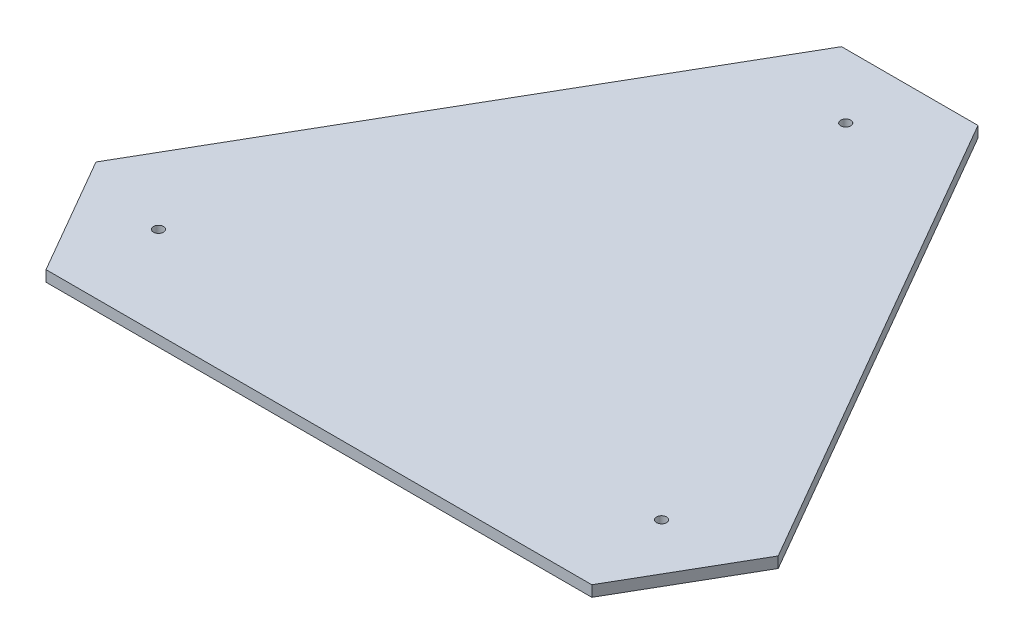
ISO-10303-21;
HEADER;
FILE_DESCRIPTION(('STEP AP214'),'2;1');
FILE_NAME('part.step','',(''),(''),'','','');
FILE_SCHEMA(('AUTOMOTIVE_DESIGN { 1 0 10303 214 1 1 1 1 }'));
ENDSEC;
DATA;
#1=APPLICATION_CONTEXT('core data for automotive mechanical design processes');
#2=APPLICATION_PROTOCOL_DEFINITION('international standard','automotive_design',2000,#1);
#3=PRODUCT_CONTEXT('',#1,'mechanical');
#4=PRODUCT('Part','Part','',(#3));
#5=PRODUCT_RELATED_PRODUCT_CATEGORY('part','',(#4));
#6=PRODUCT_DEFINITION_FORMATION('','',#4);
#7=PRODUCT_DEFINITION_CONTEXT('part definition',#1,'design');
#8=PRODUCT_DEFINITION('design','',#6,#7);
#9=PRODUCT_DEFINITION_SHAPE('','',#8);
#10=(LENGTH_UNIT() NAMED_UNIT(*) SI_UNIT(.MILLI.,.METRE.));
#11=(NAMED_UNIT(*) PLANE_ANGLE_UNIT() SI_UNIT($,.RADIAN.));
#12=(NAMED_UNIT(*) SI_UNIT($,.STERADIAN.) SOLID_ANGLE_UNIT());
#13=UNCERTAINTY_MEASURE_WITH_UNIT(LENGTH_MEASURE(1.E-05),#10,'distance_accuracy_value','');
#14=(GEOMETRIC_REPRESENTATION_CONTEXT(3) GLOBAL_UNCERTAINTY_ASSIGNED_CONTEXT((#13)) GLOBAL_UNIT_ASSIGNED_CONTEXT((#10,
#11,#12)) REPRESENTATION_CONTEXT('',''));
#15=CARTESIAN_POINT('',(0.,0.,0.));
#16=DIRECTION('',(0.,0.,1.));
#17=DIRECTION('',(1.,0.,0.));
#18=AXIS2_PLACEMENT_3D('',#15,#16,#17);
#19=CARTESIAN_POINT('',(-187.5,6.,64.9519052838329));
#20=DIRECTION('',(0.866025403784439,0.,0.5));
#21=DIRECTION('',(0.5,0.,-0.866025403784439));
#22=AXIS2_PLACEMENT_3D('',#19,#20,#21);
#23=PLANE('',#22);
#24=DIRECTION('',(-0.5,0.,0.866025403784439));
#25=VECTOR('',#24,1.);
#26=CARTESIAN_POINT('',(-187.5,0.,64.9519052838329));
#27=LINE('',#26,#25);
#28=CARTESIAN_POINT('',(-37.5,0.,-194.855715851499));
#29=VERTEX_POINT('',#28);
#30=CARTESIAN_POINT('',(-187.5,0.,64.9519052838329));
#31=VERTEX_POINT('',#30);
#32=EDGE_CURVE('E118',#29,#31,#27,.T.);
#33=ORIENTED_EDGE('',*,*,#32,.T.);
#34=DIRECTION('',(0.,-1.,0.));
#35=VECTOR('',#34,1.);
#36=CARTESIAN_POINT('',(-187.5,6.,64.9519052838329));
#37=LINE('',#36,#35);
#38=CARTESIAN_POINT('',(-187.5,6.,64.9519052838329));
#39=VERTEX_POINT('',#38);
#40=EDGE_CURVE('E11',#39,#31,#37,.T.);
#41=ORIENTED_EDGE('',*,*,#40,.F.);
#42=DIRECTION('',(-0.5,0.,0.866025403784439));
#43=VECTOR('',#42,1.);
#44=CARTESIAN_POINT('',(-187.5,6.,64.9519052838329));
#45=LINE('',#44,#43);
#46=CARTESIAN_POINT('',(-37.5,6.,-194.855715851499));
#47=VERTEX_POINT('',#46);
#48=EDGE_CURVE('E129',#47,#39,#45,.T.);
#49=ORIENTED_EDGE('',*,*,#48,.F.);
#50=DIRECTION('',(0.,-1.,0.));
#51=VECTOR('',#50,1.);
#52=CARTESIAN_POINT('',(-37.5,6.,-194.855715851499));
#53=LINE('',#52,#51);
#54=EDGE_CURVE('E114',#47,#29,#53,.T.);
#55=ORIENTED_EDGE('',*,*,#54,.T.);
#56=EDGE_LOOP('',(#33,#41,#49,#55));
#57=FACE_BOUND('',#56,.T.);
#58=ADVANCED_FACE('F34',(#57),#23,.F.);
#59=CARTESIAN_POINT('',(-150.,6.,129.903810567666));
#60=DIRECTION('',(0.866025403784439,0.,-0.499999999999999));
#61=DIRECTION('',(-0.499999999999999,0.,-0.866025403784439));
#62=AXIS2_PLACEMENT_3D('',#59,#60,#61);
#63=PLANE('',#62);
#64=DIRECTION('',(0.499999999999999,0.,0.866025403784439));
#65=VECTOR('',#64,1.);
#66=CARTESIAN_POINT('',(-150.,0.,129.903810567666));
#67=LINE('',#66,#65);
#68=CARTESIAN_POINT('',(-150.,0.,129.903810567666));
#69=VERTEX_POINT('',#68);
#70=EDGE_CURVE('E121',#31,#69,#67,.T.);
#71=ORIENTED_EDGE('',*,*,#70,.T.);
#72=DIRECTION('',(0.,-1.,0.));
#73=VECTOR('',#72,1.);
#74=CARTESIAN_POINT('',(-150.,6.,129.903810567666));
#75=LINE('',#74,#73);
#76=CARTESIAN_POINT('',(-150.,6.,129.903810567666));
#77=VERTEX_POINT('',#76);
#78=EDGE_CURVE('E42',#77,#69,#75,.T.);
#79=ORIENTED_EDGE('',*,*,#78,.F.);
#80=DIRECTION('',(0.499999999999999,0.,0.866025403784439));
#81=VECTOR('',#80,1.);
#82=CARTESIAN_POINT('',(-150.,6.,129.903810567666));
#83=LINE('',#82,#81);
#84=EDGE_CURVE('E87',#39,#77,#83,.T.);
#85=ORIENTED_EDGE('',*,*,#84,.F.);
#86=ORIENTED_EDGE('',*,*,#40,.T.);
#87=EDGE_LOOP('',(#71,#79,#85,#86));
#88=FACE_BOUND('',#87,.T.);
#89=ADVANCED_FACE('F155',(#88),#63,.F.);
#90=CARTESIAN_POINT('',(150.,6.,129.903810567666));
#91=DIRECTION('',(0.,0.,-1.));
#92=DIRECTION('',(-1.,0.,0.));
#93=AXIS2_PLACEMENT_3D('',#90,#91,#92);
#94=PLANE('',#93);
#95=DIRECTION('',(1.,0.,0.));
#96=VECTOR('',#95,1.);
#97=CARTESIAN_POINT('',(150.,0.,129.903810567666));
#98=LINE('',#97,#96);
#99=CARTESIAN_POINT('',(150.,0.,129.903810567666));
#100=VERTEX_POINT('',#99);
#101=EDGE_CURVE('E124',#69,#100,#98,.T.);
#102=ORIENTED_EDGE('',*,*,#101,.T.);
#103=DIRECTION('',(0.,-1.,0.));
#104=VECTOR('',#103,1.);
#105=CARTESIAN_POINT('',(150.,6.,129.903810567666));
#106=LINE('',#105,#104);
#107=CARTESIAN_POINT('',(150.,6.,129.903810567666));
#108=VERTEX_POINT('',#107);
#109=EDGE_CURVE('E109',#108,#100,#106,.T.);
#110=ORIENTED_EDGE('',*,*,#109,.F.);
#111=DIRECTION('',(1.,0.,0.));
#112=VECTOR('',#111,1.);
#113=CARTESIAN_POINT('',(150.,6.,129.903810567666));
#114=LINE('',#113,#112);
#115=EDGE_CURVE('E100',#77,#108,#114,.T.);
#116=ORIENTED_EDGE('',*,*,#115,.F.);
#117=ORIENTED_EDGE('',*,*,#78,.T.);
#118=EDGE_LOOP('',(#102,#110,#116,#117));
#119=FACE_BOUND('',#118,.T.);
#120=ADVANCED_FACE('F135',(#119),#94,.F.);
#121=CARTESIAN_POINT('',(187.5,6.,64.9519052838328));
#122=DIRECTION('',(-0.866025403784439,0.,-0.499999999999999));
#123=DIRECTION('',(-0.499999999999999,0.,0.866025403784439));
#124=AXIS2_PLACEMENT_3D('',#121,#122,#123);
#125=PLANE('',#124);
#126=DIRECTION('',(0.499999999999999,0.,-0.866025403784439));
#127=VECTOR('',#126,1.);
#128=CARTESIAN_POINT('',(187.5,0.,64.9519052838328));
#129=LINE('',#128,#127);
#130=CARTESIAN_POINT('',(187.5,0.,64.9519052838328));
#131=VERTEX_POINT('',#130);
#132=EDGE_CURVE('E108',#100,#131,#129,.T.);
#133=ORIENTED_EDGE('',*,*,#132,.T.);
#134=DIRECTION('',(0.,-1.,0.));
#135=VECTOR('',#134,1.);
#136=CARTESIAN_POINT('',(187.5,6.,64.9519052838328));
#137=LINE('',#136,#135);
#138=CARTESIAN_POINT('',(187.5,6.,64.9519052838328));
#139=VERTEX_POINT('',#138);
#140=EDGE_CURVE('E105',#139,#131,#137,.T.);
#141=ORIENTED_EDGE('',*,*,#140,.F.);
#142=DIRECTION('',(0.499999999999999,0.,-0.866025403784439));
#143=VECTOR('',#142,1.);
#144=CARTESIAN_POINT('',(187.5,6.,64.9519052838328));
#145=LINE('',#144,#143);
#146=EDGE_CURVE('E94',#108,#139,#145,.T.);
#147=ORIENTED_EDGE('',*,*,#146,.F.);
#148=ORIENTED_EDGE('',*,*,#109,.T.);
#149=EDGE_LOOP('',(#133,#141,#147,#148));
#150=FACE_BOUND('',#149,.T.);
#151=ADVANCED_FACE('F106',(#150),#125,.F.);
#152=CARTESIAN_POINT('',(37.4999999999999,6.,-194.855715851499));
#153=DIRECTION('',(-0.866025403784439,0.,0.5));
#154=DIRECTION('',(0.5,0.,0.866025403784439));
#155=AXIS2_PLACEMENT_3D('',#152,#153,#154);
#156=PLANE('',#155);
#157=DIRECTION('',(-0.5,0.,-0.866025403784439));
#158=VECTOR('',#157,1.);
#159=CARTESIAN_POINT('',(37.4999999999999,0.,-194.855715851499));
#160=LINE('',#159,#158);
#161=CARTESIAN_POINT('',(37.4999999999999,0.,-194.855715851499));
#162=VERTEX_POINT('',#161);
#163=EDGE_CURVE('E73',#131,#162,#160,.T.);
#164=ORIENTED_EDGE('',*,*,#163,.T.);
#165=DIRECTION('',(0.,-1.,0.));
#166=VECTOR('',#165,1.);
#167=CARTESIAN_POINT('',(37.4999999999999,6.,-194.855715851499));
#168=LINE('',#167,#166);
#169=CARTESIAN_POINT('',(37.4999999999999,6.,-194.855715851499));
#170=VERTEX_POINT('',#169);
#171=EDGE_CURVE('E110',#170,#162,#168,.T.);
#172=ORIENTED_EDGE('',*,*,#171,.F.);
#173=DIRECTION('',(-0.5,0.,-0.866025403784439));
#174=VECTOR('',#173,1.);
#175=CARTESIAN_POINT('',(37.4999999999999,6.,-194.855715851499));
#176=LINE('',#175,#174);
#177=EDGE_CURVE('E98',#139,#170,#176,.T.);
#178=ORIENTED_EDGE('',*,*,#177,.F.);
#179=ORIENTED_EDGE('',*,*,#140,.T.);
#180=EDGE_LOOP('',(#164,#172,#178,#179));
#181=FACE_BOUND('',#180,.T.);
#182=ADVANCED_FACE('F112',(#181),#156,.F.);
#183=CARTESIAN_POINT('',(-37.5,6.,-194.855715851499));
#184=DIRECTION('',(0.,0.,1.));
#185=DIRECTION('',(1.,0.,0.));
#186=AXIS2_PLACEMENT_3D('',#183,#184,#185);
#187=PLANE('',#186);
#188=DIRECTION('',(-1.,0.,0.));
#189=VECTOR('',#188,1.);
#190=CARTESIAN_POINT('',(-37.5,0.,-194.855715851499));
#191=LINE('',#190,#189);
#192=EDGE_CURVE('E79',#162,#29,#191,.T.);
#193=ORIENTED_EDGE('',*,*,#192,.T.);
#194=ORIENTED_EDGE('',*,*,#54,.F.);
#195=DIRECTION('',(-1.,0.,0.));
#196=VECTOR('',#195,1.);
#197=CARTESIAN_POINT('',(-37.5,6.,-194.855715851499));
#198=LINE('',#197,#196);
#199=EDGE_CURVE('E50',#170,#47,#198,.T.);
#200=ORIENTED_EDGE('',*,*,#199,.F.);
#201=ORIENTED_EDGE('',*,*,#171,.T.);
#202=EDGE_LOOP('',(#193,#194,#200,#201));
#203=FACE_BOUND('',#202,.T.);
#204=ADVANCED_FACE('F142',(#203),#187,.F.);
#205=CARTESIAN_POINT('',(0.,6.,0.));
#206=DIRECTION('',(0.,-1.,0.));
#207=DIRECTION('',(0.,0.,-1.));
#208=AXIS2_PLACEMENT_3D('',#205,#206,#207);
#209=PLANE('',#208);
#210=CARTESIAN_POINT('',(-138.253529965215,6.,79.820712741832));
#211=DIRECTION('',(0.,1.,0.));
#212=DIRECTION('',(0.,0.,1.));
#213=AXIS2_PLACEMENT_3D('',#210,#211,#212);
#214=CIRCLE('',#213,2.75000000000001);
#215=CARTESIAN_POINT('',(-138.253529965215,6.,82.570712741832));
#216=VERTEX_POINT('',#215);
#217=EDGE_CURVE('E226',#216,#216,#214,.T.);
#218=ORIENTED_EDGE('',*,*,#217,.F.);
#219=EDGE_LOOP('',(#218));
#220=FACE_BOUND('',#219,.T.);
#221=CARTESIAN_POINT('',(138.253529965209,6.,79.8207127418302));
#222=DIRECTION('',(0.,1.,0.));
#223=DIRECTION('',(0.,0.,1.));
#224=AXIS2_PLACEMENT_3D('',#221,#222,#223);
#225=CIRCLE('',#224,2.75000000000001);
#226=CARTESIAN_POINT('',(138.253529965209,6.,82.5707127418302));
#227=VERTEX_POINT('',#226);
#228=EDGE_CURVE('E231',#227,#227,#225,.T.);
#229=ORIENTED_EDGE('',*,*,#228,.F.);
#230=EDGE_LOOP('',(#229));
#231=FACE_BOUND('',#230,.T.);
#232=CARTESIAN_POINT('',(0.,6.,-159.641425483665));
#233=DIRECTION('',(0.,1.,0.));
#234=DIRECTION('',(0.,0.,1.));
#235=AXIS2_PLACEMENT_3D('',#232,#233,#234);
#236=CIRCLE('',#235,2.75);
#237=CARTESIAN_POINT('',(0.,6.,-156.891425483665));
#238=VERTEX_POINT('',#237);
#239=EDGE_CURVE('E122',#238,#238,#236,.T.);
#240=ORIENTED_EDGE('',*,*,#239,.F.);
#241=EDGE_LOOP('',(#240));
#242=FACE_BOUND('',#241,.T.);
#243=ORIENTED_EDGE('',*,*,#48,.T.);
#244=ORIENTED_EDGE('',*,*,#84,.T.);
#245=ORIENTED_EDGE('',*,*,#115,.T.);
#246=ORIENTED_EDGE('',*,*,#146,.T.);
#247=ORIENTED_EDGE('',*,*,#177,.T.);
#248=ORIENTED_EDGE('',*,*,#199,.T.);
#249=EDGE_LOOP('',(#243,#244,#245,#246,#247,#248));
#250=FACE_BOUND('',#249,.T.);
#251=ADVANCED_FACE('F96',(#220,#231,#242,#250),#209,.F.);
#252=CARTESIAN_POINT('',(0.,0.,0.));
#253=DIRECTION('',(0.,-1.,0.));
#254=DIRECTION('',(0.,0.,-1.));
#255=AXIS2_PLACEMENT_3D('',#252,#253,#254);
#256=PLANE('',#255);
#257=CARTESIAN_POINT('',(-138.253529965215,0.,79.820712741832));
#258=DIRECTION('',(0.,-1.,0.));
#259=DIRECTION('',(0.,0.,-1.));
#260=AXIS2_PLACEMENT_3D('',#257,#258,#259);
#261=CIRCLE('',#260,2.75000000000001);
#262=CARTESIAN_POINT('',(-138.253529965215,0.,82.570712741832));
#263=VERTEX_POINT('',#262);
#264=EDGE_CURVE('E223',#263,#263,#261,.F.);
#265=ORIENTED_EDGE('',*,*,#264,.T.);
#266=EDGE_LOOP('',(#265));
#267=FACE_BOUND('',#266,.T.);
#268=CARTESIAN_POINT('',(138.253529965209,0.,79.8207127418302));
#269=DIRECTION('',(0.,-1.,0.));
#270=DIRECTION('',(0.,0.,-1.));
#271=AXIS2_PLACEMENT_3D('',#268,#269,#270);
#272=CIRCLE('',#271,2.75000000000001);
#273=CARTESIAN_POINT('',(138.253529965209,0.,82.5707127418302));
#274=VERTEX_POINT('',#273);
#275=EDGE_CURVE('E236',#274,#274,#272,.F.);
#276=ORIENTED_EDGE('',*,*,#275,.T.);
#277=EDGE_LOOP('',(#276));
#278=FACE_BOUND('',#277,.T.);
#279=CARTESIAN_POINT('',(0.,0.,-159.641425483665));
#280=DIRECTION('',(0.,-1.,0.));
#281=DIRECTION('',(0.,0.,-1.));
#282=AXIS2_PLACEMENT_3D('',#279,#280,#281);
#283=CIRCLE('',#282,2.75);
#284=CARTESIAN_POINT('',(0.,0.,-156.891425483665));
#285=VERTEX_POINT('',#284);
#286=EDGE_CURVE('E227',#285,#285,#283,.F.);
#287=ORIENTED_EDGE('',*,*,#286,.T.);
#288=EDGE_LOOP('',(#287));
#289=FACE_BOUND('',#288,.T.);
#290=ORIENTED_EDGE('',*,*,#32,.F.);
#291=ORIENTED_EDGE('',*,*,#192,.F.);
#292=ORIENTED_EDGE('',*,*,#163,.F.);
#293=ORIENTED_EDGE('',*,*,#132,.F.);
#294=ORIENTED_EDGE('',*,*,#101,.F.);
#295=ORIENTED_EDGE('',*,*,#70,.F.);
#296=EDGE_LOOP('',(#290,#291,#292,#293,#294,#295));
#297=FACE_BOUND('',#296,.T.);
#298=ADVANCED_FACE('F138',(#267,#278,#289,#297),#256,.T.);
#299=CARTESIAN_POINT('',(0.,-0.00100000000000013,-159.641425483665));
#300=DIRECTION('',(0.,1.,0.));
#301=DIRECTION('',(0.,0.,1.));
#302=AXIS2_PLACEMENT_3D('',#299,#300,#301);
#303=CYLINDRICAL_SURFACE('',#302,2.75);
#304=CARTESIAN_POINT('',(0.,0.,-156.891425483665));
#305=CARTESIAN_POINT('',(0.,0.0624999999999999,-156.891425483665));
#306=CARTESIAN_POINT('',(0.,0.125,-156.891425483665));
#307=CARTESIAN_POINT('',(0.,0.25,-156.891425483665));
#308=CARTESIAN_POINT('',(0.,0.3125,-156.891425483665));
#309=CARTESIAN_POINT('',(0.,0.4375,-156.891425483665));
#310=CARTESIAN_POINT('',(0.,0.5,-156.891425483665));
#311=CARTESIAN_POINT('',(0.,0.625,-156.891425483665));
#312=CARTESIAN_POINT('',(0.,0.6875,-156.891425483665));
#313=CARTESIAN_POINT('',(0.,0.8125,-156.891425483665));
#314=CARTESIAN_POINT('',(0.,0.875,-156.891425483665));
#315=CARTESIAN_POINT('',(0.,1.,-156.891425483665));
#316=CARTESIAN_POINT('',(0.,1.0625,-156.891425483665));
#317=CARTESIAN_POINT('',(0.,1.1875,-156.891425483665));
#318=CARTESIAN_POINT('',(0.,1.25,-156.891425483665));
#319=CARTESIAN_POINT('',(0.,1.375,-156.891425483665));
#320=CARTESIAN_POINT('',(0.,1.4375,-156.891425483665));
#321=CARTESIAN_POINT('',(0.,1.5625,-156.891425483665));
#322=CARTESIAN_POINT('',(0.,1.625,-156.891425483665));
#323=CARTESIAN_POINT('',(0.,1.75,-156.891425483665));
#324=CARTESIAN_POINT('',(0.,1.8125,-156.891425483665));
#325=CARTESIAN_POINT('',(0.,1.9375,-156.891425483665));
#326=CARTESIAN_POINT('',(0.,2.,-156.891425483665));
#327=CARTESIAN_POINT('',(0.,2.125,-156.891425483665));
#328=CARTESIAN_POINT('',(0.,2.1875,-156.891425483665));
#329=CARTESIAN_POINT('',(0.,2.3125,-156.891425483665));
#330=CARTESIAN_POINT('',(0.,2.375,-156.891425483665));
#331=CARTESIAN_POINT('',(0.,2.5,-156.891425483665));
#332=CARTESIAN_POINT('',(0.,2.5625,-156.891425483665));
#333=CARTESIAN_POINT('',(0.,2.6875,-156.891425483665));
#334=CARTESIAN_POINT('',(0.,2.75,-156.891425483665));
#335=CARTESIAN_POINT('',(0.,2.875,-156.891425483665));
#336=CARTESIAN_POINT('',(0.,2.9375,-156.891425483665));
#337=CARTESIAN_POINT('',(0.,3.0625,-156.891425483665));
#338=CARTESIAN_POINT('',(0.,3.125,-156.891425483665));
#339=CARTESIAN_POINT('',(0.,3.25,-156.891425483665));
#340=CARTESIAN_POINT('',(0.,3.3125,-156.891425483665));
#341=CARTESIAN_POINT('',(0.,3.4375,-156.891425483665));
#342=CARTESIAN_POINT('',(0.,3.5,-156.891425483665));
#343=CARTESIAN_POINT('',(0.,3.625,-156.891425483665));
#344=CARTESIAN_POINT('',(0.,3.6875,-156.891425483665));
#345=CARTESIAN_POINT('',(0.,3.8125,-156.891425483665));
#346=CARTESIAN_POINT('',(0.,3.875,-156.891425483665));
#347=CARTESIAN_POINT('',(0.,4.,-156.891425483665));
#348=CARTESIAN_POINT('',(0.,4.0625,-156.891425483665));
#349=CARTESIAN_POINT('',(0.,4.1875,-156.891425483665));
#350=CARTESIAN_POINT('',(0.,4.25,-156.891425483665));
#351=CARTESIAN_POINT('',(0.,4.375,-156.891425483665));
#352=CARTESIAN_POINT('',(0.,4.4375,-156.891425483665));
#353=CARTESIAN_POINT('',(0.,4.5625,-156.891425483665));
#354=CARTESIAN_POINT('',(0.,4.625,-156.891425483665));
#355=CARTESIAN_POINT('',(0.,4.75,-156.891425483665));
#356=CARTESIAN_POINT('',(0.,4.8125,-156.891425483665));
#357=CARTESIAN_POINT('',(0.,4.9375,-156.891425483665));
#358=CARTESIAN_POINT('',(0.,5.,-156.891425483665));
#359=CARTESIAN_POINT('',(0.,5.125,-156.891425483665));
#360=CARTESIAN_POINT('',(0.,5.1875,-156.891425483665));
#361=CARTESIAN_POINT('',(0.,5.3125,-156.891425483665));
#362=CARTESIAN_POINT('',(0.,5.375,-156.891425483665));
#363=CARTESIAN_POINT('',(0.,5.5,-156.891425483665));
#364=CARTESIAN_POINT('',(0.,5.5625,-156.891425483665));
#365=CARTESIAN_POINT('',(0.,5.6875,-156.891425483665));
#366=CARTESIAN_POINT('',(0.,5.75,-156.891425483665));
#367=CARTESIAN_POINT('',(0.,5.875,-156.891425483665));
#368=CARTESIAN_POINT('',(0.,5.9375,-156.891425483665));
#369=CARTESIAN_POINT('',(0.,6.,-156.891425483665));
#370=B_SPLINE_CURVE_WITH_KNOTS('',3,(#304,#305,#306,#307,#308,#309,#310,#311,#312,#313,#314,
#315,#316,#317,#318,#319,#320,#321,#322,#323,#324,#325,#326,#327,#328,#329,#330,#331,#332,#333,
#334,#335,#336,#337,#338,#339,#340,#341,#342,#343,#344,#345,#346,#347,#348,#349,#350,#351,#352,
#353,#354,#355,#356,#357,#358,#359,#360,#361,#362,#363,#364,#365,#366,#367,#368,#369),
.UNSPECIFIED.,.F.,.F.,(4,2,2,2,2,2,2,2,2,2,2,2,2,2,2,2,2,2,2,2,2,2,2,2,2,2,2,2,2,2,2,2,4),(0.,
0.1875,0.375,0.5625,0.75,0.9375,1.125,1.3125,1.5,1.6875,1.875,2.0625,2.25,2.4375,2.625,2.8125,
3.,3.1875,3.375,3.5625,3.75,3.9375,4.125,4.3125,4.5,4.6875,4.875,5.0625,5.25,5.4375,5.625,
5.8125,6.),.UNSPECIFIED.);
#371=EDGE_CURVE('BSEAM188',#285,#238,#370,.T.);
#372=ORIENTED_EDGE('',*,*,#286,.F.);
#373=ORIENTED_EDGE('',*,*,#239,.T.);
#374=ORIENTED_EDGE('',*,*,#371,.T.);
#375=ORIENTED_EDGE('',*,*,#371,.F.);
#376=EDGE_LOOP('',(#372,#374,#373,#375));
#377=FACE_BOUND('',#376,.T.);
#378=ADVANCED_FACE('F188',(#377),#303,.F.);
#379=CARTESIAN_POINT('',(138.253529965209,-0.00100000000000013,79.8207127418302));
#380=DIRECTION('',(0.,1.,0.));
#381=DIRECTION('',(0.,0.,1.));
#382=AXIS2_PLACEMENT_3D('',#379,#380,#381);
#383=CYLINDRICAL_SURFACE('',#382,2.75000000000001);
#384=CARTESIAN_POINT('',(138.253529965209,0.,82.5707127418302));
#385=CARTESIAN_POINT('',(138.253529965209,0.0624999999999999,82.5707127418302));
#386=CARTESIAN_POINT('',(138.253529965209,0.125,82.5707127418302));
#387=CARTESIAN_POINT('',(138.253529965209,0.25,82.5707127418302));
#388=CARTESIAN_POINT('',(138.253529965209,0.3125,82.5707127418302));
#389=CARTESIAN_POINT('',(138.253529965209,0.4375,82.5707127418302));
#390=CARTESIAN_POINT('',(138.253529965209,0.5,82.5707127418302));
#391=CARTESIAN_POINT('',(138.253529965209,0.625,82.5707127418302));
#392=CARTESIAN_POINT('',(138.253529965209,0.6875,82.5707127418302));
#393=CARTESIAN_POINT('',(138.253529965209,0.8125,82.5707127418302));
#394=CARTESIAN_POINT('',(138.253529965209,0.875,82.5707127418302));
#395=CARTESIAN_POINT('',(138.253529965209,1.,82.5707127418302));
#396=CARTESIAN_POINT('',(138.253529965209,1.0625,82.5707127418302));
#397=CARTESIAN_POINT('',(138.253529965209,1.1875,82.5707127418302));
#398=CARTESIAN_POINT('',(138.253529965209,1.25,82.5707127418302));
#399=CARTESIAN_POINT('',(138.253529965209,1.375,82.5707127418302));
#400=CARTESIAN_POINT('',(138.253529965209,1.4375,82.5707127418302));
#401=CARTESIAN_POINT('',(138.253529965209,1.5625,82.5707127418302));
#402=CARTESIAN_POINT('',(138.253529965209,1.625,82.5707127418302));
#403=CARTESIAN_POINT('',(138.253529965209,1.75,82.5707127418302));
#404=CARTESIAN_POINT('',(138.253529965209,1.8125,82.5707127418302));
#405=CARTESIAN_POINT('',(138.253529965209,1.9375,82.5707127418302));
#406=CARTESIAN_POINT('',(138.253529965209,2.,82.5707127418302));
#407=CARTESIAN_POINT('',(138.253529965209,2.125,82.5707127418302));
#408=CARTESIAN_POINT('',(138.253529965209,2.1875,82.5707127418302));
#409=CARTESIAN_POINT('',(138.253529965209,2.3125,82.5707127418302));
#410=CARTESIAN_POINT('',(138.253529965209,2.375,82.5707127418302));
#411=CARTESIAN_POINT('',(138.253529965209,2.5,82.5707127418302));
#412=CARTESIAN_POINT('',(138.253529965209,2.5625,82.5707127418302));
#413=CARTESIAN_POINT('',(138.253529965209,2.6875,82.5707127418302));
#414=CARTESIAN_POINT('',(138.253529965209,2.75,82.5707127418302));
#415=CARTESIAN_POINT('',(138.253529965209,2.875,82.5707127418302));
#416=CARTESIAN_POINT('',(138.253529965209,2.9375,82.5707127418302));
#417=CARTESIAN_POINT('',(138.253529965209,3.0625,82.5707127418302));
#418=CARTESIAN_POINT('',(138.253529965209,3.125,82.5707127418302));
#419=CARTESIAN_POINT('',(138.253529965209,3.25,82.5707127418302));
#420=CARTESIAN_POINT('',(138.253529965209,3.3125,82.5707127418302));
#421=CARTESIAN_POINT('',(138.253529965209,3.4375,82.5707127418302));
#422=CARTESIAN_POINT('',(138.253529965209,3.5,82.5707127418302));
#423=CARTESIAN_POINT('',(138.253529965209,3.625,82.5707127418302));
#424=CARTESIAN_POINT('',(138.253529965209,3.6875,82.5707127418302));
#425=CARTESIAN_POINT('',(138.253529965209,3.8125,82.5707127418302));
#426=CARTESIAN_POINT('',(138.253529965209,3.875,82.5707127418302));
#427=CARTESIAN_POINT('',(138.253529965209,4.,82.5707127418302));
#428=CARTESIAN_POINT('',(138.253529965209,4.0625,82.5707127418302));
#429=CARTESIAN_POINT('',(138.253529965209,4.1875,82.5707127418302));
#430=CARTESIAN_POINT('',(138.253529965209,4.25,82.5707127418302));
#431=CARTESIAN_POINT('',(138.253529965209,4.375,82.5707127418302));
#432=CARTESIAN_POINT('',(138.253529965209,4.4375,82.5707127418302));
#433=CARTESIAN_POINT('',(138.253529965209,4.5625,82.5707127418302));
#434=CARTESIAN_POINT('',(138.253529965209,4.625,82.5707127418302));
#435=CARTESIAN_POINT('',(138.253529965209,4.75,82.5707127418302));
#436=CARTESIAN_POINT('',(138.253529965209,4.8125,82.5707127418302));
#437=CARTESIAN_POINT('',(138.253529965209,4.9375,82.5707127418302));
#438=CARTESIAN_POINT('',(138.253529965209,5.,82.5707127418302));
#439=CARTESIAN_POINT('',(138.253529965209,5.125,82.5707127418302));
#440=CARTESIAN_POINT('',(138.253529965209,5.1875,82.5707127418302));
#441=CARTESIAN_POINT('',(138.253529965209,5.3125,82.5707127418302));
#442=CARTESIAN_POINT('',(138.253529965209,5.375,82.5707127418302));
#443=CARTESIAN_POINT('',(138.253529965209,5.5,82.5707127418302));
#444=CARTESIAN_POINT('',(138.253529965209,5.5625,82.5707127418302));
#445=CARTESIAN_POINT('',(138.253529965209,5.6875,82.5707127418302));
#446=CARTESIAN_POINT('',(138.253529965209,5.75,82.5707127418302));
#447=CARTESIAN_POINT('',(138.253529965209,5.875,82.5707127418302));
#448=CARTESIAN_POINT('',(138.253529965209,5.9375,82.5707127418302));
#449=CARTESIAN_POINT('',(138.253529965209,6.,82.5707127418302));
#450=B_SPLINE_CURVE_WITH_KNOTS('',3,(#384,#385,#386,#387,#388,#389,#390,#391,#392,#393,#394,
#395,#396,#397,#398,#399,#400,#401,#402,#403,#404,#405,#406,#407,#408,#409,#410,#411,#412,#413,
#414,#415,#416,#417,#418,#419,#420,#421,#422,#423,#424,#425,#426,#427,#428,#429,#430,#431,#432,
#433,#434,#435,#436,#437,#438,#439,#440,#441,#442,#443,#444,#445,#446,#447,#448,#449),
.UNSPECIFIED.,.F.,.F.,(4,2,2,2,2,2,2,2,2,2,2,2,2,2,2,2,2,2,2,2,2,2,2,2,2,2,2,2,2,2,2,2,4),(0.,
0.1875,0.375,0.5625,0.75,0.9375,1.125,1.3125,1.5,1.6875,1.875,2.0625,2.25,2.4375,2.625,2.8125,
3.,3.1875,3.375,3.5625,3.75,3.9375,4.125,4.3125,4.5,4.6875,4.875,5.0625,5.25,5.4375,5.625,
5.8125,6.),.UNSPECIFIED.);
#451=EDGE_CURVE('BSEAM196',#274,#227,#450,.T.);
#452=ORIENTED_EDGE('',*,*,#275,.F.);
#453=ORIENTED_EDGE('',*,*,#228,.T.);
#454=ORIENTED_EDGE('',*,*,#451,.T.);
#455=ORIENTED_EDGE('',*,*,#451,.F.);
#456=EDGE_LOOP('',(#452,#454,#453,#455));
#457=FACE_BOUND('',#456,.T.);
#458=ADVANCED_FACE('F196',(#457),#383,.F.);
#459=CARTESIAN_POINT('',(-138.253529965215,-0.00100000000000013,79.820712741832));
#460=DIRECTION('',(0.,1.,0.));
#461=DIRECTION('',(0.,0.,1.));
#462=AXIS2_PLACEMENT_3D('',#459,#460,#461);
#463=CYLINDRICAL_SURFACE('',#462,2.75000000000001);
#464=CARTESIAN_POINT('',(-138.253529965215,0.,82.570712741832));
#465=CARTESIAN_POINT('',(-138.253529965215,0.0624999999999999,82.570712741832));
#466=CARTESIAN_POINT('',(-138.253529965215,0.125,82.570712741832));
#467=CARTESIAN_POINT('',(-138.253529965215,0.25,82.570712741832));
#468=CARTESIAN_POINT('',(-138.253529965215,0.3125,82.570712741832));
#469=CARTESIAN_POINT('',(-138.253529965215,0.4375,82.570712741832));
#470=CARTESIAN_POINT('',(-138.253529965215,0.5,82.570712741832));
#471=CARTESIAN_POINT('',(-138.253529965215,0.625,82.570712741832));
#472=CARTESIAN_POINT('',(-138.253529965215,0.6875,82.570712741832));
#473=CARTESIAN_POINT('',(-138.253529965215,0.8125,82.570712741832));
#474=CARTESIAN_POINT('',(-138.253529965215,0.875,82.570712741832));
#475=CARTESIAN_POINT('',(-138.253529965215,1.,82.570712741832));
#476=CARTESIAN_POINT('',(-138.253529965215,1.0625,82.570712741832));
#477=CARTESIAN_POINT('',(-138.253529965215,1.1875,82.570712741832));
#478=CARTESIAN_POINT('',(-138.253529965215,1.25,82.570712741832));
#479=CARTESIAN_POINT('',(-138.253529965215,1.375,82.570712741832));
#480=CARTESIAN_POINT('',(-138.253529965215,1.4375,82.570712741832));
#481=CARTESIAN_POINT('',(-138.253529965215,1.5625,82.570712741832));
#482=CARTESIAN_POINT('',(-138.253529965215,1.625,82.570712741832));
#483=CARTESIAN_POINT('',(-138.253529965215,1.75,82.570712741832));
#484=CARTESIAN_POINT('',(-138.253529965215,1.8125,82.570712741832));
#485=CARTESIAN_POINT('',(-138.253529965215,1.9375,82.570712741832));
#486=CARTESIAN_POINT('',(-138.253529965215,2.,82.570712741832));
#487=CARTESIAN_POINT('',(-138.253529965215,2.125,82.570712741832));
#488=CARTESIAN_POINT('',(-138.253529965215,2.1875,82.570712741832));
#489=CARTESIAN_POINT('',(-138.253529965215,2.3125,82.570712741832));
#490=CARTESIAN_POINT('',(-138.253529965215,2.375,82.570712741832));
#491=CARTESIAN_POINT('',(-138.253529965215,2.5,82.570712741832));
#492=CARTESIAN_POINT('',(-138.253529965215,2.5625,82.570712741832));
#493=CARTESIAN_POINT('',(-138.253529965215,2.6875,82.570712741832));
#494=CARTESIAN_POINT('',(-138.253529965215,2.75,82.570712741832));
#495=CARTESIAN_POINT('',(-138.253529965215,2.875,82.570712741832));
#496=CARTESIAN_POINT('',(-138.253529965215,2.9375,82.570712741832));
#497=CARTESIAN_POINT('',(-138.253529965215,3.0625,82.570712741832));
#498=CARTESIAN_POINT('',(-138.253529965215,3.125,82.570712741832));
#499=CARTESIAN_POINT('',(-138.253529965215,3.25,82.570712741832));
#500=CARTESIAN_POINT('',(-138.253529965215,3.3125,82.570712741832));
#501=CARTESIAN_POINT('',(-138.253529965215,3.4375,82.570712741832));
#502=CARTESIAN_POINT('',(-138.253529965215,3.5,82.570712741832));
#503=CARTESIAN_POINT('',(-138.253529965215,3.625,82.570712741832));
#504=CARTESIAN_POINT('',(-138.253529965215,3.6875,82.570712741832));
#505=CARTESIAN_POINT('',(-138.253529965215,3.8125,82.570712741832));
#506=CARTESIAN_POINT('',(-138.253529965215,3.875,82.570712741832));
#507=CARTESIAN_POINT('',(-138.253529965215,4.,82.570712741832));
#508=CARTESIAN_POINT('',(-138.253529965215,4.0625,82.570712741832));
#509=CARTESIAN_POINT('',(-138.253529965215,4.1875,82.570712741832));
#510=CARTESIAN_POINT('',(-138.253529965215,4.25,82.570712741832));
#511=CARTESIAN_POINT('',(-138.253529965215,4.375,82.570712741832));
#512=CARTESIAN_POINT('',(-138.253529965215,4.4375,82.570712741832));
#513=CARTESIAN_POINT('',(-138.253529965215,4.5625,82.570712741832));
#514=CARTESIAN_POINT('',(-138.253529965215,4.625,82.570712741832));
#515=CARTESIAN_POINT('',(-138.253529965215,4.75,82.570712741832));
#516=CARTESIAN_POINT('',(-138.253529965215,4.8125,82.570712741832));
#517=CARTESIAN_POINT('',(-138.253529965215,4.9375,82.570712741832));
#518=CARTESIAN_POINT('',(-138.253529965215,5.,82.570712741832));
#519=CARTESIAN_POINT('',(-138.253529965215,5.125,82.570712741832));
#520=CARTESIAN_POINT('',(-138.253529965215,5.1875,82.570712741832));
#521=CARTESIAN_POINT('',(-138.253529965215,5.3125,82.570712741832));
#522=CARTESIAN_POINT('',(-138.253529965215,5.375,82.570712741832));
#523=CARTESIAN_POINT('',(-138.253529965215,5.5,82.570712741832));
#524=CARTESIAN_POINT('',(-138.253529965215,5.5625,82.570712741832));
#525=CARTESIAN_POINT('',(-138.253529965215,5.6875,82.570712741832));
#526=CARTESIAN_POINT('',(-138.253529965215,5.75,82.570712741832));
#527=CARTESIAN_POINT('',(-138.253529965215,5.875,82.570712741832));
#528=CARTESIAN_POINT('',(-138.253529965215,5.9375,82.570712741832));
#529=CARTESIAN_POINT('',(-138.253529965215,6.,82.570712741832));
#530=B_SPLINE_CURVE_WITH_KNOTS('',3,(#464,#465,#466,#467,#468,#469,#470,#471,#472,#473,#474,
#475,#476,#477,#478,#479,#480,#481,#482,#483,#484,#485,#486,#487,#488,#489,#490,#491,#492,#493,
#494,#495,#496,#497,#498,#499,#500,#501,#502,#503,#504,#505,#506,#507,#508,#509,#510,#511,#512,
#513,#514,#515,#516,#517,#518,#519,#520,#521,#522,#523,#524,#525,#526,#527,#528,#529),
.UNSPECIFIED.,.F.,.F.,(4,2,2,2,2,2,2,2,2,2,2,2,2,2,2,2,2,2,2,2,2,2,2,2,2,2,2,2,2,2,2,2,4),(0.,
0.1875,0.375,0.5625,0.75,0.9375,1.125,1.3125,1.5,1.6875,1.875,2.0625,2.25,2.4375,2.625,2.8125,
3.,3.1875,3.375,3.5625,3.75,3.9375,4.125,4.3125,4.5,4.6875,4.875,5.0625,5.25,5.4375,5.625,
5.8125,6.),.UNSPECIFIED.);
#531=EDGE_CURVE('BSEAM206',#263,#216,#530,.T.);
#532=ORIENTED_EDGE('',*,*,#264,.F.);
#533=ORIENTED_EDGE('',*,*,#217,.T.);
#534=ORIENTED_EDGE('',*,*,#531,.T.);
#535=ORIENTED_EDGE('',*,*,#531,.F.);
#536=EDGE_LOOP('',(#532,#534,#533,#535));
#537=FACE_BOUND('',#536,.T.);
#538=ADVANCED_FACE('F206',(#537),#463,.F.);
#539=CLOSED_SHELL('',(#58,#89,#120,#151,#182,#204,#251,#298,#378,#458,#538));
#540=MANIFOLD_SOLID_BREP('B2',#539);
#541=ADVANCED_BREP_SHAPE_REPRESENTATION('',(#18,#540),#14);
#542=SHAPE_DEFINITION_REPRESENTATION(#9,#541);
ENDSEC;
END-ISO-10303-21;
